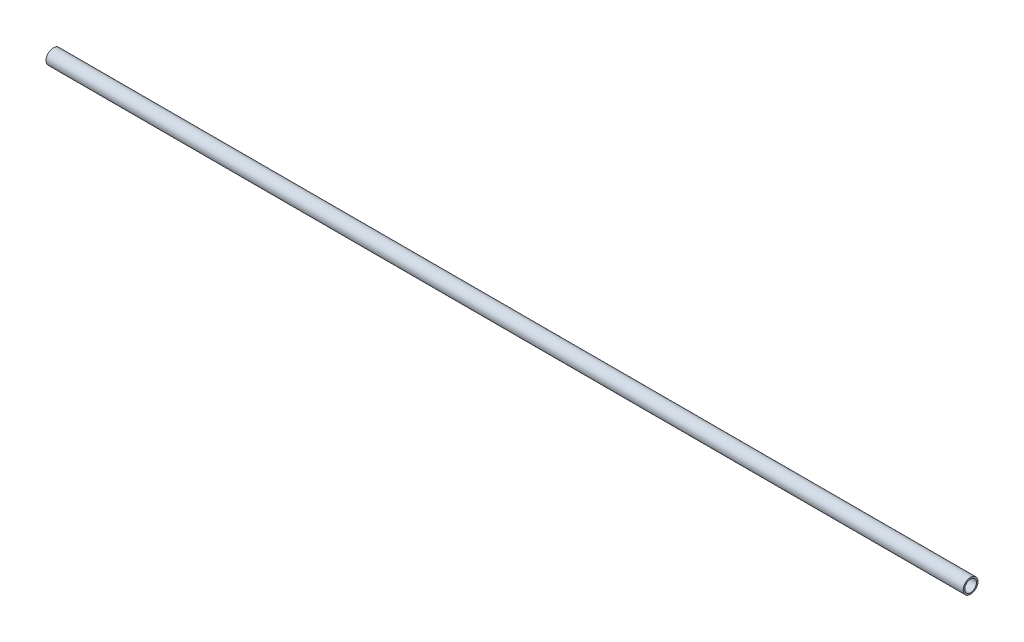
ISO-10303-21;
HEADER;
FILE_DESCRIPTION(('STEP AP214'),'2;1');
FILE_NAME('part.step','',(''),(''),'','','');
FILE_SCHEMA(('AUTOMOTIVE_DESIGN { 1 0 10303 214 1 1 1 1 }'));
ENDSEC;
DATA;
#1=APPLICATION_CONTEXT('core data for automotive mechanical design processes');
#2=APPLICATION_PROTOCOL_DEFINITION('international standard','automotive_design',2000,#1);
#3=PRODUCT_CONTEXT('',#1,'mechanical');
#4=PRODUCT('Part','Part','',(#3));
#5=PRODUCT_RELATED_PRODUCT_CATEGORY('part','',(#4));
#6=PRODUCT_DEFINITION_FORMATION('','',#4);
#7=PRODUCT_DEFINITION_CONTEXT('part definition',#1,'design');
#8=PRODUCT_DEFINITION('design','',#6,#7);
#9=PRODUCT_DEFINITION_SHAPE('','',#8);
#10=(LENGTH_UNIT() NAMED_UNIT(*) SI_UNIT(.MILLI.,.METRE.));
#11=(NAMED_UNIT(*) PLANE_ANGLE_UNIT() SI_UNIT($,.RADIAN.));
#12=(NAMED_UNIT(*) SI_UNIT($,.STERADIAN.) SOLID_ANGLE_UNIT());
#13=UNCERTAINTY_MEASURE_WITH_UNIT(LENGTH_MEASURE(1.E-05),#10,'distance_accuracy_value','');
#14=(GEOMETRIC_REPRESENTATION_CONTEXT(3) GLOBAL_UNCERTAINTY_ASSIGNED_CONTEXT((#13)) GLOBAL_UNIT_ASSIGNED_CONTEXT((#10,
#11,#12)) REPRESENTATION_CONTEXT('',''));
#15=CARTESIAN_POINT('',(0.,0.,0.));
#16=DIRECTION('',(0.,0.,1.));
#17=DIRECTION('',(1.,0.,0.));
#18=AXIS2_PLACEMENT_3D('',#15,#16,#17);
#19=CARTESIAN_POINT('',(1000.,0.,0.));
#20=DIRECTION('',(1.,0.,0.));
#21=DIRECTION('',(0.,0.,-1.));
#22=AXIS2_PLACEMENT_3D('',#19,#20,#21);
#23=PLANE('',#22);
#24=CARTESIAN_POINT('',(1000.,0.,0.));
#25=DIRECTION('',(1.,0.,0.));
#26=DIRECTION('',(0.,0.,-1.));
#27=AXIS2_PLACEMENT_3D('',#24,#25,#26);
#28=CIRCLE('',#27,8.05);
#29=CARTESIAN_POINT('',(1000.,0.,-8.05));
#30=VERTEX_POINT('',#29);
#31=EDGE_CURVE('E10',#30,#30,#28,.T.);
#32=ORIENTED_EDGE('',*,*,#31,.T.);
#33=EDGE_LOOP('',(#32));
#34=FACE_BOUND('',#33,.T.);
#35=CARTESIAN_POINT('',(1000.,0.,0.));
#36=DIRECTION('',(1.,0.,0.));
#37=DIRECTION('',(0.,0.,-1.));
#38=AXIS2_PLACEMENT_3D('',#35,#36,#37);
#39=CIRCLE('',#38,6.4);
#40=CARTESIAN_POINT('',(1000.,0.,-6.4));
#41=VERTEX_POINT('',#40);
#42=EDGE_CURVE('E50',#41,#41,#39,.T.);
#43=ORIENTED_EDGE('',*,*,#42,.F.);
#44=EDGE_LOOP('',(#43));
#45=FACE_BOUND('',#44,.T.);
#46=ADVANCED_FACE('F37',(#34,#45),#23,.T.);
#47=CARTESIAN_POINT('',(0.,0.,0.));
#48=DIRECTION('',(1.,0.,0.));
#49=DIRECTION('',(0.,0.,-1.));
#50=AXIS2_PLACEMENT_3D('',#47,#48,#49);
#51=PLANE('',#50);
#52=CARTESIAN_POINT('',(0.,0.,0.));
#53=DIRECTION('',(1.,0.,0.));
#54=DIRECTION('',(0.,0.,-1.));
#55=AXIS2_PLACEMENT_3D('',#52,#53,#54);
#56=CIRCLE('',#55,8.05);
#57=CARTESIAN_POINT('',(0.,0.,-8.05));
#58=VERTEX_POINT('',#57);
#59=EDGE_CURVE('E41',#58,#58,#56,.T.);
#60=ORIENTED_EDGE('',*,*,#59,.F.);
#61=EDGE_LOOP('',(#60));
#62=FACE_BOUND('',#61,.T.);
#63=CARTESIAN_POINT('',(0.,0.,0.));
#64=DIRECTION('',(1.,0.,0.));
#65=DIRECTION('',(0.,0.,-1.));
#66=AXIS2_PLACEMENT_3D('',#63,#64,#65);
#67=CIRCLE('',#66,6.4);
#68=CARTESIAN_POINT('',(0.,0.,-6.4));
#69=VERTEX_POINT('',#68);
#70=EDGE_CURVE('E52',#69,#69,#67,.T.);
#71=ORIENTED_EDGE('',*,*,#70,.T.);
#72=EDGE_LOOP('',(#71));
#73=FACE_BOUND('',#72,.T.);
#74=ADVANCED_FACE('F64',(#62,#73),#51,.F.);
#75=CARTESIAN_POINT('',(1000.,0.,0.));
#76=DIRECTION('',(-1.,0.,0.));
#77=DIRECTION('',(0.,0.,1.));
#78=AXIS2_PLACEMENT_3D('',#75,#76,#77);
#79=CYLINDRICAL_SURFACE('',#78,8.05);
#80=ORIENTED_EDGE('',*,*,#31,.F.);
#81=EDGE_LOOP('',(#80));
#82=FACE_BOUND('',#81,.T.);
#83=ORIENTED_EDGE('',*,*,#59,.T.);
#84=EDGE_LOOP('',(#83));
#85=FACE_BOUND('',#84,.T.);
#86=ADVANCED_FACE('F39',(#82,#85),#79,.T.);
#87=CARTESIAN_POINT('',(1000.,0.,0.));
#88=DIRECTION('',(-1.,0.,0.));
#89=DIRECTION('',(0.,0.,1.));
#90=AXIS2_PLACEMENT_3D('',#87,#88,#89);
#91=CYLINDRICAL_SURFACE('',#90,6.4);
#92=ORIENTED_EDGE('',*,*,#42,.T.);
#93=EDGE_LOOP('',(#92));
#94=FACE_BOUND('',#93,.T.);
#95=ORIENTED_EDGE('',*,*,#70,.F.);
#96=EDGE_LOOP('',(#95));
#97=FACE_BOUND('',#96,.T.);
#98=ADVANCED_FACE('F60',(#94,#97),#91,.F.);
#99=CLOSED_SHELL('',(#46,#74,#86,#98));
#100=MANIFOLD_SOLID_BREP('B2',#99);
#101=ADVANCED_BREP_SHAPE_REPRESENTATION('',(#18,#100),#14);
#102=SHAPE_DEFINITION_REPRESENTATION(#9,#101);
ENDSEC;
END-ISO-10303-21;
